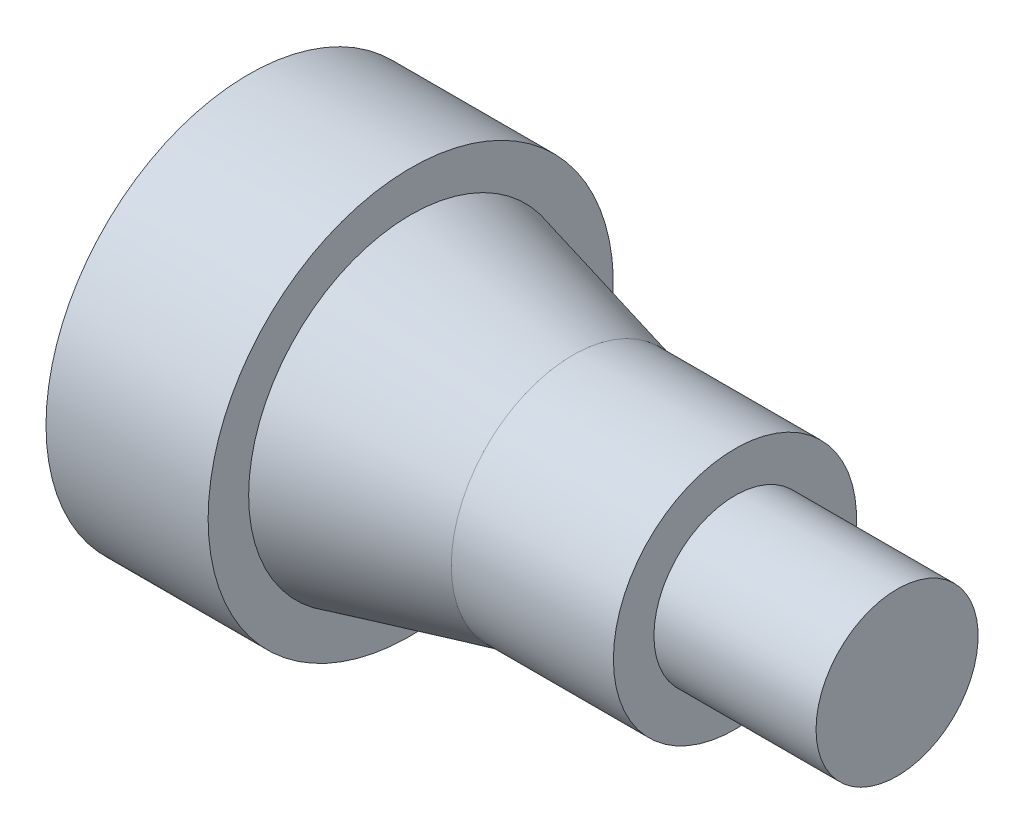
ISO-10303-21;
HEADER;
FILE_DESCRIPTION(('STEP AP214'),'2;1');
FILE_NAME('part.step','',(''),(''),'','','');
FILE_SCHEMA(('AUTOMOTIVE_DESIGN { 1 0 10303 214 1 1 1 1 }'));
ENDSEC;
DATA;
#1=APPLICATION_CONTEXT('core data for automotive mechanical design processes');
#2=APPLICATION_PROTOCOL_DEFINITION('international standard','automotive_design',2000,#1);
#3=PRODUCT_CONTEXT('',#1,'mechanical');
#4=PRODUCT('Part','Part','',(#3));
#5=PRODUCT_RELATED_PRODUCT_CATEGORY('part','',(#4));
#6=PRODUCT_DEFINITION_FORMATION('','',#4);
#7=PRODUCT_DEFINITION_CONTEXT('part definition',#1,'design');
#8=PRODUCT_DEFINITION('design','',#6,#7);
#9=PRODUCT_DEFINITION_SHAPE('','',#8);
#10=(LENGTH_UNIT() NAMED_UNIT(*) SI_UNIT(.MILLI.,.METRE.));
#11=(NAMED_UNIT(*) PLANE_ANGLE_UNIT() SI_UNIT($,.RADIAN.));
#12=(NAMED_UNIT(*) SI_UNIT($,.STERADIAN.) SOLID_ANGLE_UNIT());
#13=UNCERTAINTY_MEASURE_WITH_UNIT(LENGTH_MEASURE(1.E-05),#10,'distance_accuracy_value','');
#14=(GEOMETRIC_REPRESENTATION_CONTEXT(3) GLOBAL_UNCERTAINTY_ASSIGNED_CONTEXT((#13)) GLOBAL_UNIT_ASSIGNED_CONTEXT((#10,
#11,#12)) REPRESENTATION_CONTEXT('',''));
#15=CARTESIAN_POINT('',(0.,0.,0.));
#16=DIRECTION('',(0.,0.,1.));
#17=DIRECTION('',(1.,0.,0.));
#18=AXIS2_PLACEMENT_3D('',#15,#16,#17);
#19=CARTESIAN_POINT('',(-40.,0.,0.));
#20=DIRECTION('',(1.,0.,0.));
#21=DIRECTION('',(0.,0.,-1.));
#22=AXIS2_PLACEMENT_3D('',#19,#20,#21);
#23=PLANE('',#22);
#24=CARTESIAN_POINT('',(-40.,0.,0.));
#25=DIRECTION('',(-1.,0.,0.));
#26=DIRECTION('',(0.,0.,1.));
#27=AXIS2_PLACEMENT_3D('',#24,#25,#26);
#28=CIRCLE('',#27,25.);
#29=CARTESIAN_POINT('',(-40.,0.,25.));
#30=VERTEX_POINT('',#29);
#31=EDGE_CURVE('E10',#30,#30,#28,.T.);
#32=ORIENTED_EDGE('',*,*,#31,.T.);
#33=EDGE_LOOP('',(#32));
#34=FACE_BOUND('',#33,.T.);
#35=ADVANCED_FACE('F31',(#34),#23,.F.);
#36=CARTESIAN_POINT('',(-49.7588747488279,0.,0.));
#37=DIRECTION('',(-1.,0.,0.));
#38=DIRECTION('',(0.,0.,1.));
#39=AXIS2_PLACEMENT_3D('',#36,#37,#38);
#40=CYLINDRICAL_SURFACE('',#39,25.);
#41=ORIENTED_EDGE('',*,*,#31,.F.);
#42=EDGE_LOOP('',(#41));
#43=FACE_BOUND('',#42,.T.);
#44=CARTESIAN_POINT('',(-20.,0.,0.));
#45=DIRECTION('',(-1.,0.,0.));
#46=DIRECTION('',(0.,0.,1.));
#47=AXIS2_PLACEMENT_3D('',#44,#45,#46);
#48=CIRCLE('',#47,25.);
#49=CARTESIAN_POINT('',(-20.,0.,25.));
#50=VERTEX_POINT('',#49);
#51=EDGE_CURVE('E37',#50,#50,#48,.T.);
#52=ORIENTED_EDGE('',*,*,#51,.T.);
#53=EDGE_LOOP('',(#52));
#54=FACE_BOUND('',#53,.T.);
#55=ADVANCED_FACE('F72',(#43,#54),#40,.T.);
#56=CARTESIAN_POINT('',(-20.,0.,-25.));
#57=DIRECTION('',(-1.,0.,0.));
#58=DIRECTION('',(0.,0.,1.));
#59=AXIS2_PLACEMENT_3D('',#56,#57,#58);
#60=PLANE('',#59);
#61=ORIENTED_EDGE('',*,*,#51,.F.);
#62=EDGE_LOOP('',(#61));
#63=FACE_BOUND('',#62,.T.);
#64=CARTESIAN_POINT('',(-20.,0.,0.));
#65=DIRECTION('',(-1.,0.,0.));
#66=DIRECTION('',(0.,0.,1.));
#67=AXIS2_PLACEMENT_3D('',#64,#65,#66);
#68=CIRCLE('',#67,20.);
#69=CARTESIAN_POINT('',(-20.,0.,20.));
#70=VERTEX_POINT('',#69);
#71=EDGE_CURVE('E41',#70,#70,#68,.T.);
#72=ORIENTED_EDGE('',*,*,#71,.T.);
#73=EDGE_LOOP('',(#72));
#74=FACE_BOUND('',#73,.T.);
#75=ADVANCED_FACE('F76',(#63,#74),#60,.F.);
#76=CARTESIAN_POINT('',(0.,0.,0.));
#77=DIRECTION('',(-1.,0.,0.));
#78=DIRECTION('',(0.,0.,1.));
#79=AXIS2_PLACEMENT_3D('',#76,#77,#78);
#80=CONICAL_SURFACE('',#79,15.,0.244978663126864);
#81=ORIENTED_EDGE('',*,*,#71,.F.);
#82=EDGE_LOOP('',(#81));
#83=FACE_BOUND('',#82,.T.);
#84=CARTESIAN_POINT('',(0.,0.,0.));
#85=DIRECTION('',(-1.,0.,0.));
#86=DIRECTION('',(0.,0.,1.));
#87=AXIS2_PLACEMENT_3D('',#84,#85,#86);
#88=CIRCLE('',#87,15.);
#89=CARTESIAN_POINT('',(0.,0.,15.));
#90=VERTEX_POINT('',#89);
#91=EDGE_CURVE('E45',#90,#90,#88,.T.);
#92=ORIENTED_EDGE('',*,*,#91,.T.);
#93=EDGE_LOOP('',(#92));
#94=FACE_BOUND('',#93,.T.);
#95=ADVANCED_FACE('F81',(#83,#94),#80,.T.);
#96=CARTESIAN_POINT('',(-49.7588747488279,0.,0.));
#97=DIRECTION('',(-1.,0.,0.));
#98=DIRECTION('',(0.,0.,1.));
#99=AXIS2_PLACEMENT_3D('',#96,#97,#98);
#100=CYLINDRICAL_SURFACE('',#99,15.);
#101=ORIENTED_EDGE('',*,*,#91,.F.);
#102=EDGE_LOOP('',(#101));
#103=FACE_BOUND('',#102,.T.);
#104=CARTESIAN_POINT('',(20.,0.,0.));
#105=DIRECTION('',(-1.,0.,0.));
#106=DIRECTION('',(0.,0.,1.));
#107=AXIS2_PLACEMENT_3D('',#104,#105,#106);
#108=CIRCLE('',#107,15.);
#109=CARTESIAN_POINT('',(20.,0.,15.));
#110=VERTEX_POINT('',#109);
#111=EDGE_CURVE('E50',#110,#110,#108,.T.);
#112=ORIENTED_EDGE('',*,*,#111,.T.);
#113=EDGE_LOOP('',(#112));
#114=FACE_BOUND('',#113,.T.);
#115=ADVANCED_FACE('F87',(#103,#114),#100,.T.);
#116=CARTESIAN_POINT('',(20.,0.,-15.));
#117=DIRECTION('',(-1.,0.,0.));
#118=DIRECTION('',(0.,0.,1.));
#119=AXIS2_PLACEMENT_3D('',#116,#117,#118);
#120=PLANE('',#119);
#121=ORIENTED_EDGE('',*,*,#111,.F.);
#122=EDGE_LOOP('',(#121));
#123=FACE_BOUND('',#122,.T.);
#124=CARTESIAN_POINT('',(20.,0.,0.));
#125=DIRECTION('',(-1.,0.,0.));
#126=DIRECTION('',(0.,0.,1.));
#127=AXIS2_PLACEMENT_3D('',#124,#125,#126);
#128=CIRCLE('',#127,10.);
#129=CARTESIAN_POINT('',(20.,0.,10.));
#130=VERTEX_POINT('',#129);
#131=EDGE_CURVE('E53',#130,#130,#128,.T.);
#132=ORIENTED_EDGE('',*,*,#131,.T.);
#133=EDGE_LOOP('',(#132));
#134=FACE_BOUND('',#133,.T.);
#135=ADVANCED_FACE('F68',(#123,#134),#120,.F.);
#136=CARTESIAN_POINT('',(-49.7588747488279,0.,0.));
#137=DIRECTION('',(-1.,0.,0.));
#138=DIRECTION('',(0.,0.,1.));
#139=AXIS2_PLACEMENT_3D('',#136,#137,#138);
#140=CYLINDRICAL_SURFACE('',#139,10.);
#141=ORIENTED_EDGE('',*,*,#131,.F.);
#142=EDGE_LOOP('',(#141));
#143=FACE_BOUND('',#142,.T.);
#144=CARTESIAN_POINT('',(40.,0.,0.));
#145=DIRECTION('',(-1.,0.,0.));
#146=DIRECTION('',(0.,0.,1.));
#147=AXIS2_PLACEMENT_3D('',#144,#145,#146);
#148=CIRCLE('',#147,10.);
#149=CARTESIAN_POINT('',(40.,0.,10.));
#150=VERTEX_POINT('',#149);
#151=EDGE_CURVE('E56',#150,#150,#148,.T.);
#152=ORIENTED_EDGE('',*,*,#151,.T.);
#153=EDGE_LOOP('',(#152));
#154=FACE_BOUND('',#153,.T.);
#155=ADVANCED_FACE('F60',(#143,#154),#140,.T.);
#156=CARTESIAN_POINT('',(40.,0.,-10.));
#157=DIRECTION('',(-1.,0.,0.));
#158=DIRECTION('',(0.,0.,1.));
#159=AXIS2_PLACEMENT_3D('',#156,#157,#158);
#160=PLANE('',#159);
#161=ORIENTED_EDGE('',*,*,#151,.F.);
#162=EDGE_LOOP('',(#161));
#163=FACE_BOUND('',#162,.T.);
#164=ADVANCED_FACE('F62',(#163),#160,.F.);
#165=CLOSED_SHELL('',(#35,#55,#75,#95,#115,#135,#155,#164));
#166=MANIFOLD_SOLID_BREP('B2',#165);
#167=ADVANCED_BREP_SHAPE_REPRESENTATION('',(#18,#166),#14);
#168=SHAPE_DEFINITION_REPRESENTATION(#9,#167);
ENDSEC;
END-ISO-10303-21;
